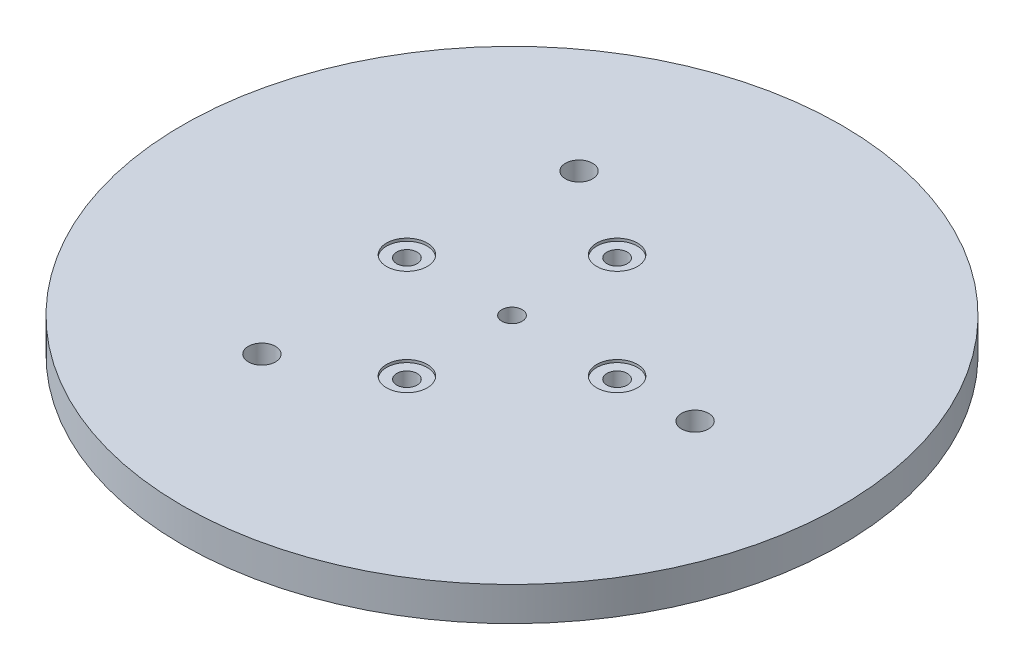
ISO-10303-21;
HEADER;
FILE_DESCRIPTION(('STEP AP214'),'2;1');
FILE_NAME('part.step','',(''),(''),'','','');
FILE_SCHEMA(('AUTOMOTIVE_DESIGN { 1 0 10303 214 1 1 1 1 }'));
ENDSEC;
DATA;
#1=APPLICATION_CONTEXT('core data for automotive mechanical design processes');
#2=APPLICATION_PROTOCOL_DEFINITION('international standard','automotive_design',2000,#1);
#3=PRODUCT_CONTEXT('',#1,'mechanical');
#4=PRODUCT('Part','Part','',(#3));
#5=PRODUCT_RELATED_PRODUCT_CATEGORY('part','',(#4));
#6=PRODUCT_DEFINITION_FORMATION('','',#4);
#7=PRODUCT_DEFINITION_CONTEXT('part definition',#1,'design');
#8=PRODUCT_DEFINITION('design','',#6,#7);
#9=PRODUCT_DEFINITION_SHAPE('','',#8);
#10=(LENGTH_UNIT() NAMED_UNIT(*) SI_UNIT(.MILLI.,.METRE.));
#11=(NAMED_UNIT(*) PLANE_ANGLE_UNIT() SI_UNIT($,.RADIAN.));
#12=(NAMED_UNIT(*) SI_UNIT($,.STERADIAN.) SOLID_ANGLE_UNIT());
#13=UNCERTAINTY_MEASURE_WITH_UNIT(LENGTH_MEASURE(1.E-05),#10,'distance_accuracy_value','');
#14=(GEOMETRIC_REPRESENTATION_CONTEXT(3) GLOBAL_UNCERTAINTY_ASSIGNED_CONTEXT((#13)) GLOBAL_UNIT_ASSIGNED_CONTEXT((#10,
#11,#12)) REPRESENTATION_CONTEXT('',''));
#15=CARTESIAN_POINT('',(0.,0.,0.));
#16=DIRECTION('',(0.,0.,1.));
#17=DIRECTION('',(1.,0.,0.));
#18=AXIS2_PLACEMENT_3D('',#15,#16,#17);
#19=CARTESIAN_POINT('',(-15.5,-19.,0.));
#20=DIRECTION('',(0.,1.,0.));
#21=DIRECTION('',(0.,0.,1.));
#22=AXIS2_PLACEMENT_3D('',#19,#20,#21);
#23=CYLINDRICAL_SURFACE('',#22,1.5);
#24=CARTESIAN_POINT('',(-15.5,1.,0.));
#25=DIRECTION('',(0.,1.,0.));
#26=DIRECTION('',(0.,0.,1.));
#27=AXIS2_PLACEMENT_3D('',#24,#25,#26);
#28=CIRCLE('',#27,1.5);
#29=CARTESIAN_POINT('',(-15.5,1.,1.5));
#30=VERTEX_POINT('',#29);
#31=EDGE_CURVE('E52',#30,#30,#28,.T.);
#32=ORIENTED_EDGE('',*,*,#31,.F.);
#33=EDGE_LOOP('',(#32));
#34=FACE_BOUND('',#33,.T.);
#35=CARTESIAN_POINT('',(-15.5,5.6,0.));
#36=DIRECTION('',(0.,1.,0.));
#37=DIRECTION('',(0.,0.,1.));
#38=AXIS2_PLACEMENT_3D('',#35,#36,#37);
#39=CIRCLE('',#38,1.5);
#40=CARTESIAN_POINT('',(-15.5,5.6,1.5));
#41=VERTEX_POINT('',#40);
#42=EDGE_CURVE('E114',#41,#41,#39,.T.);
#43=ORIENTED_EDGE('',*,*,#42,.T.);
#44=EDGE_LOOP('',(#43));
#45=FACE_BOUND('',#44,.T.);
#46=ADVANCED_FACE('F14',(#34,#45),#23,.F.);
#47=CARTESIAN_POINT('',(0.,-19.,-15.5));
#48=DIRECTION('',(0.,1.,0.));
#49=DIRECTION('',(0.,0.,1.));
#50=AXIS2_PLACEMENT_3D('',#47,#48,#49);
#51=CYLINDRICAL_SURFACE('',#50,1.5);
#52=CARTESIAN_POINT('',(0.,1.,-15.5));
#53=DIRECTION('',(0.,1.,0.));
#54=DIRECTION('',(0.,0.,1.));
#55=AXIS2_PLACEMENT_3D('',#52,#53,#54);
#56=CIRCLE('',#55,1.5);
#57=CARTESIAN_POINT('',(0.,1.,-14.));
#58=VERTEX_POINT('',#57);
#59=EDGE_CURVE('E56',#58,#58,#56,.T.);
#60=ORIENTED_EDGE('',*,*,#59,.F.);
#61=EDGE_LOOP('',(#60));
#62=FACE_BOUND('',#61,.T.);
#63=CARTESIAN_POINT('',(0.,5.6,-15.5));
#64=DIRECTION('',(0.,1.,0.));
#65=DIRECTION('',(0.,0.,1.));
#66=AXIS2_PLACEMENT_3D('',#63,#64,#65);
#67=CIRCLE('',#66,1.5);
#68=CARTESIAN_POINT('',(0.,5.6,-14.));
#69=VERTEX_POINT('',#68);
#70=EDGE_CURVE('E126',#69,#69,#67,.T.);
#71=ORIENTED_EDGE('',*,*,#70,.T.);
#72=EDGE_LOOP('',(#71));
#73=FACE_BOUND('',#72,.T.);
#74=ADVANCED_FACE('F176',(#62,#73),#51,.F.);
#75=CARTESIAN_POINT('',(15.5,-19.,0.));
#76=DIRECTION('',(0.,1.,0.));
#77=DIRECTION('',(0.,0.,1.));
#78=AXIS2_PLACEMENT_3D('',#75,#76,#77);
#79=CYLINDRICAL_SURFACE('',#78,1.5);
#80=CARTESIAN_POINT('',(15.5,1.,0.));
#81=DIRECTION('',(0.,1.,0.));
#82=DIRECTION('',(0.,0.,1.));
#83=AXIS2_PLACEMENT_3D('',#80,#81,#82);
#84=CIRCLE('',#83,1.5);
#85=CARTESIAN_POINT('',(15.5,1.,1.5));
#86=VERTEX_POINT('',#85);
#87=EDGE_CURVE('E61',#86,#86,#84,.T.);
#88=ORIENTED_EDGE('',*,*,#87,.F.);
#89=EDGE_LOOP('',(#88));
#90=FACE_BOUND('',#89,.T.);
#91=CARTESIAN_POINT('',(15.5,5.6,0.));
#92=DIRECTION('',(0.,1.,0.));
#93=DIRECTION('',(0.,0.,1.));
#94=AXIS2_PLACEMENT_3D('',#91,#92,#93);
#95=CIRCLE('',#94,1.5);
#96=CARTESIAN_POINT('',(15.5,5.6,1.5));
#97=VERTEX_POINT('',#96);
#98=EDGE_CURVE('E103',#97,#97,#95,.T.);
#99=ORIENTED_EDGE('',*,*,#98,.T.);
#100=EDGE_LOOP('',(#99));
#101=FACE_BOUND('',#100,.T.);
#102=ADVANCED_FACE('F81',(#90,#101),#79,.F.);
#103=CARTESIAN_POINT('',(0.,-19.,15.5));
#104=DIRECTION('',(0.,1.,0.));
#105=DIRECTION('',(0.,0.,1.));
#106=AXIS2_PLACEMENT_3D('',#103,#104,#105);
#107=CYLINDRICAL_SURFACE('',#106,1.5);
#108=CARTESIAN_POINT('',(0.,1.,15.5));
#109=DIRECTION('',(0.,1.,0.));
#110=DIRECTION('',(0.,0.,1.));
#111=AXIS2_PLACEMENT_3D('',#108,#109,#110);
#112=CIRCLE('',#111,1.5);
#113=CARTESIAN_POINT('',(0.,1.,17.));
#114=VERTEX_POINT('',#113);
#115=EDGE_CURVE('E18',#114,#114,#112,.T.);
#116=ORIENTED_EDGE('',*,*,#115,.F.);
#117=EDGE_LOOP('',(#116));
#118=FACE_BOUND('',#117,.T.);
#119=CARTESIAN_POINT('',(0.,5.6,15.5));
#120=DIRECTION('',(0.,1.,0.));
#121=DIRECTION('',(0.,0.,1.));
#122=AXIS2_PLACEMENT_3D('',#119,#120,#121);
#123=CIRCLE('',#122,1.5);
#124=CARTESIAN_POINT('',(0.,5.6,17.));
#125=VERTEX_POINT('',#124);
#126=EDGE_CURVE('E85',#125,#125,#123,.T.);
#127=ORIENTED_EDGE('',*,*,#126,.T.);
#128=EDGE_LOOP('',(#127));
#129=FACE_BOUND('',#128,.T.);
#130=ADVANCED_FACE('F77',(#118,#129),#107,.F.);
#131=CARTESIAN_POINT('',(-13.5,6.,23.3826859021798));
#132=DIRECTION('',(0.,-1.,0.));
#133=DIRECTION('',(0.,0.,-1.));
#134=AXIS2_PLACEMENT_3D('',#131,#132,#133);
#135=CYLINDRICAL_SURFACE('',#134,2.);
#136=CARTESIAN_POINT('',(-13.5,6.,23.3826859021798));
#137=DIRECTION('',(0.,1.,0.));
#138=DIRECTION('',(0.,0.,1.));
#139=AXIS2_PLACEMENT_3D('',#136,#137,#138);
#140=CIRCLE('',#139,2.);
#141=CARTESIAN_POINT('',(-13.5,6.,25.3826859021798));
#142=VERTEX_POINT('',#141);
#143=EDGE_CURVE('E23',#142,#142,#140,.T.);
#144=ORIENTED_EDGE('',*,*,#143,.T.);
#145=EDGE_LOOP('',(#144));
#146=FACE_BOUND('',#145,.T.);
#147=CARTESIAN_POINT('',(-13.5,1.,23.3826859021798));
#148=DIRECTION('',(0.,1.,0.));
#149=DIRECTION('',(0.,0.,1.));
#150=AXIS2_PLACEMENT_3D('',#147,#148,#149);
#151=CIRCLE('',#150,2.);
#152=CARTESIAN_POINT('',(-13.5,1.,25.3826859021798));
#153=VERTEX_POINT('',#152);
#154=EDGE_CURVE('E43',#153,#153,#151,.T.);
#155=ORIENTED_EDGE('',*,*,#154,.F.);
#156=EDGE_LOOP('',(#155));
#157=FACE_BOUND('',#156,.T.);
#158=ADVANCED_FACE('F80',(#146,#157),#135,.F.);
#159=CARTESIAN_POINT('',(27.,6.,0.));
#160=DIRECTION('',(0.,-1.,0.));
#161=DIRECTION('',(0.,0.,-1.));
#162=AXIS2_PLACEMENT_3D('',#159,#160,#161);
#163=CYLINDRICAL_SURFACE('',#162,2.);
#164=CARTESIAN_POINT('',(27.,6.,0.));
#165=DIRECTION('',(0.,1.,0.));
#166=DIRECTION('',(0.,0.,1.));
#167=AXIS2_PLACEMENT_3D('',#164,#165,#166);
#168=CIRCLE('',#167,2.);
#169=CARTESIAN_POINT('',(27.,6.,2.));
#170=VERTEX_POINT('',#169);
#171=EDGE_CURVE('E31',#170,#170,#168,.T.);
#172=ORIENTED_EDGE('',*,*,#171,.T.);
#173=EDGE_LOOP('',(#172));
#174=FACE_BOUND('',#173,.T.);
#175=CARTESIAN_POINT('',(27.,1.,0.));
#176=DIRECTION('',(0.,1.,0.));
#177=DIRECTION('',(0.,0.,1.));
#178=AXIS2_PLACEMENT_3D('',#175,#176,#177);
#179=CIRCLE('',#178,2.);
#180=CARTESIAN_POINT('',(27.,1.,2.));
#181=VERTEX_POINT('',#180);
#182=EDGE_CURVE('E39',#181,#181,#179,.T.);
#183=ORIENTED_EDGE('',*,*,#182,.F.);
#184=EDGE_LOOP('',(#183));
#185=FACE_BOUND('',#184,.T.);
#186=ADVANCED_FACE('F145',(#174,#185),#163,.F.);
#187=CARTESIAN_POINT('',(-13.5,6.,-23.3826859021798));
#188=DIRECTION('',(0.,-1.,0.));
#189=DIRECTION('',(0.,0.,-1.));
#190=AXIS2_PLACEMENT_3D('',#187,#188,#189);
#191=CYLINDRICAL_SURFACE('',#190,2.);
#192=CARTESIAN_POINT('',(-13.5,6.,-23.3826859021798));
#193=DIRECTION('',(0.,1.,0.));
#194=DIRECTION('',(0.,0.,1.));
#195=AXIS2_PLACEMENT_3D('',#192,#193,#194);
#196=CIRCLE('',#195,2.);
#197=CARTESIAN_POINT('',(-13.5,6.,-21.3826859021799));
#198=VERTEX_POINT('',#197);
#199=EDGE_CURVE('E51',#198,#198,#196,.T.);
#200=ORIENTED_EDGE('',*,*,#199,.T.);
#201=EDGE_LOOP('',(#200));
#202=FACE_BOUND('',#201,.T.);
#203=CARTESIAN_POINT('',(-13.5,1.,-23.3826859021798));
#204=DIRECTION('',(0.,1.,0.));
#205=DIRECTION('',(0.,0.,1.));
#206=AXIS2_PLACEMENT_3D('',#203,#204,#205);
#207=CIRCLE('',#206,2.);
#208=CARTESIAN_POINT('',(-13.5,1.,-21.3826859021799));
#209=VERTEX_POINT('',#208);
#210=EDGE_CURVE('E35',#209,#209,#207,.T.);
#211=ORIENTED_EDGE('',*,*,#210,.F.);
#212=EDGE_LOOP('',(#211));
#213=FACE_BOUND('',#212,.T.);
#214=ADVANCED_FACE('F16',(#202,#213),#191,.F.);
#215=CARTESIAN_POINT('',(0.,6.,0.));
#216=DIRECTION('',(0.,-1.,0.));
#217=DIRECTION('',(0.,0.,-1.));
#218=AXIS2_PLACEMENT_3D('',#215,#216,#217);
#219=CYLINDRICAL_SURFACE('',#218,48.6);
#220=CARTESIAN_POINT('',(0.,6.,0.));
#221=DIRECTION('',(0.,1.,0.));
#222=DIRECTION('',(0.,0.,1.));
#223=AXIS2_PLACEMENT_3D('',#220,#221,#222);
#224=CIRCLE('',#223,48.6);
#225=CARTESIAN_POINT('',(0.,6.,48.6));
#226=VERTEX_POINT('',#225);
#227=EDGE_CURVE('E9',#226,#226,#224,.T.);
#228=ORIENTED_EDGE('',*,*,#227,.F.);
#229=EDGE_LOOP('',(#228));
#230=FACE_BOUND('',#229,.T.);
#231=CARTESIAN_POINT('',(0.,1.,0.));
#232=DIRECTION('',(0.,1.,0.));
#233=DIRECTION('',(0.,0.,1.));
#234=AXIS2_PLACEMENT_3D('',#231,#232,#233);
#235=CIRCLE('',#234,48.6);
#236=CARTESIAN_POINT('',(0.,1.,48.6));
#237=VERTEX_POINT('',#236);
#238=EDGE_CURVE('E47',#237,#237,#235,.T.);
#239=ORIENTED_EDGE('',*,*,#238,.T.);
#240=EDGE_LOOP('',(#239));
#241=FACE_BOUND('',#240,.T.);
#242=ADVANCED_FACE('F151',(#230,#241),#219,.T.);
#243=CARTESIAN_POINT('',(0.,6.,0.));
#244=DIRECTION('',(0.,1.,0.));
#245=DIRECTION('',(-1.,0.,0.));
#246=AXIS2_PLACEMENT_3D('',#243,#244,#245);
#247=PLANE('',#246);
#248=CARTESIAN_POINT('',(0.,6.,15.5));
#249=DIRECTION('',(0.,1.,0.));
#250=DIRECTION('',(0.,0.,1.));
#251=AXIS2_PLACEMENT_3D('',#248,#249,#250);
#252=CIRCLE('',#251,3.);
#253=CARTESIAN_POINT('',(0.,6.,18.5));
#254=VERTEX_POINT('',#253);
#255=EDGE_CURVE('E96',#254,#254,#252,.T.);
#256=ORIENTED_EDGE('',*,*,#255,.F.);
#257=EDGE_LOOP('',(#256));
#258=FACE_BOUND('',#257,.T.);
#259=CARTESIAN_POINT('',(15.5,6.,0.));
#260=DIRECTION('',(0.,1.,0.));
#261=DIRECTION('',(0.,0.,1.));
#262=AXIS2_PLACEMENT_3D('',#259,#260,#261);
#263=CIRCLE('',#262,3.);
#264=CARTESIAN_POINT('',(15.5,6.,3.));
#265=VERTEX_POINT('',#264);
#266=EDGE_CURVE('E107',#265,#265,#263,.T.);
#267=ORIENTED_EDGE('',*,*,#266,.F.);
#268=EDGE_LOOP('',(#267));
#269=FACE_BOUND('',#268,.T.);
#270=CARTESIAN_POINT('',(-15.5,6.,0.));
#271=DIRECTION('',(0.,1.,0.));
#272=DIRECTION('',(0.,0.,1.));
#273=AXIS2_PLACEMENT_3D('',#270,#271,#272);
#274=CIRCLE('',#273,3.);
#275=CARTESIAN_POINT('',(-15.5,6.,3.));
#276=VERTEX_POINT('',#275);
#277=EDGE_CURVE('E119',#276,#276,#274,.T.);
#278=ORIENTED_EDGE('',*,*,#277,.F.);
#279=EDGE_LOOP('',(#278));
#280=FACE_BOUND('',#279,.T.);
#281=CARTESIAN_POINT('',(0.,6.,-15.5));
#282=DIRECTION('',(0.,1.,0.));
#283=DIRECTION('',(0.,0.,1.));
#284=AXIS2_PLACEMENT_3D('',#281,#282,#283);
#285=CIRCLE('',#284,3.);
#286=CARTESIAN_POINT('',(0.,6.,-12.5));
#287=VERTEX_POINT('',#286);
#288=EDGE_CURVE('E131',#287,#287,#285,.T.);
#289=ORIENTED_EDGE('',*,*,#288,.F.);
#290=EDGE_LOOP('',(#289));
#291=FACE_BOUND('',#290,.T.);
#292=CARTESIAN_POINT('',(0.,6.,0.));
#293=DIRECTION('',(0.,1.,0.));
#294=DIRECTION('',(0.,0.,1.));
#295=AXIS2_PLACEMENT_3D('',#292,#293,#294);
#296=CIRCLE('',#295,1.5);
#297=CARTESIAN_POINT('',(0.,6.,1.5));
#298=VERTEX_POINT('',#297);
#299=EDGE_CURVE('E57',#298,#298,#296,.T.);
#300=ORIENTED_EDGE('',*,*,#299,.F.);
#301=EDGE_LOOP('',(#300));
#302=FACE_BOUND('',#301,.T.);
#303=ORIENTED_EDGE('',*,*,#199,.F.);
#304=EDGE_LOOP('',(#303));
#305=FACE_BOUND('',#304,.T.);
#306=ORIENTED_EDGE('',*,*,#171,.F.);
#307=EDGE_LOOP('',(#306));
#308=FACE_BOUND('',#307,.T.);
#309=ORIENTED_EDGE('',*,*,#143,.F.);
#310=EDGE_LOOP('',(#309));
#311=FACE_BOUND('',#310,.T.);
#312=ORIENTED_EDGE('',*,*,#227,.T.);
#313=EDGE_LOOP('',(#312));
#314=FACE_BOUND('',#313,.T.);
#315=ADVANCED_FACE('F148',(#258,#269,#280,#291,#302,#305,#308,#311,#314),#247,.T.);
#316=CARTESIAN_POINT('',(0.,1.,0.));
#317=DIRECTION('',(0.,1.,0.));
#318=DIRECTION('',(-1.,0.,0.));
#319=AXIS2_PLACEMENT_3D('',#316,#317,#318);
#320=PLANE('',#319);
#321=ORIENTED_EDGE('',*,*,#115,.T.);
#322=EDGE_LOOP('',(#321));
#323=FACE_BOUND('',#322,.T.);
#324=CARTESIAN_POINT('',(0.,1.,0.));
#325=DIRECTION('',(0.,1.,0.));
#326=DIRECTION('',(0.,0.,1.));
#327=AXIS2_PLACEMENT_3D('',#324,#325,#326);
#328=CIRCLE('',#327,1.5);
#329=CARTESIAN_POINT('',(0.,1.,1.5));
#330=VERTEX_POINT('',#329);
#331=EDGE_CURVE('E64',#330,#330,#328,.T.);
#332=ORIENTED_EDGE('',*,*,#331,.T.);
#333=EDGE_LOOP('',(#332));
#334=FACE_BOUND('',#333,.T.);
#335=ORIENTED_EDGE('',*,*,#87,.T.);
#336=EDGE_LOOP('',(#335));
#337=FACE_BOUND('',#336,.T.);
#338=ORIENTED_EDGE('',*,*,#59,.T.);
#339=EDGE_LOOP('',(#338));
#340=FACE_BOUND('',#339,.T.);
#341=ORIENTED_EDGE('',*,*,#31,.T.);
#342=EDGE_LOOP('',(#341));
#343=FACE_BOUND('',#342,.T.);
#344=ORIENTED_EDGE('',*,*,#210,.T.);
#345=EDGE_LOOP('',(#344));
#346=FACE_BOUND('',#345,.T.);
#347=ORIENTED_EDGE('',*,*,#182,.T.);
#348=EDGE_LOOP('',(#347));
#349=FACE_BOUND('',#348,.T.);
#350=ORIENTED_EDGE('',*,*,#154,.T.);
#351=EDGE_LOOP('',(#350));
#352=FACE_BOUND('',#351,.T.);
#353=ORIENTED_EDGE('',*,*,#238,.F.);
#354=EDGE_LOOP('',(#353));
#355=FACE_BOUND('',#354,.T.);
#356=ADVANCED_FACE('F75',(#323,#334,#337,#340,#343,#346,#349,#352,#355),#320,.F.);
#357=CARTESIAN_POINT('',(0.,-19.,0.));
#358=DIRECTION('',(0.,1.,0.));
#359=DIRECTION('',(0.,0.,1.));
#360=AXIS2_PLACEMENT_3D('',#357,#358,#359);
#361=CYLINDRICAL_SURFACE('',#360,1.5);
#362=ORIENTED_EDGE('',*,*,#299,.T.);
#363=EDGE_LOOP('',(#362));
#364=FACE_BOUND('',#363,.T.);
#365=ORIENTED_EDGE('',*,*,#331,.F.);
#366=EDGE_LOOP('',(#365));
#367=FACE_BOUND('',#366,.T.);
#368=ADVANCED_FACE('F163',(#364,#367),#361,.F.);
#369=CARTESIAN_POINT('',(0.,5.6,15.5));
#370=DIRECTION('',(0.,1.,0.));
#371=DIRECTION('',(0.,0.,1.));
#372=AXIS2_PLACEMENT_3D('',#369,#370,#371);
#373=CYLINDRICAL_SURFACE('',#372,3.);
#374=CARTESIAN_POINT('',(0.,5.6,15.5));
#375=DIRECTION('',(0.,1.,0.));
#376=DIRECTION('',(0.,0.,1.));
#377=AXIS2_PLACEMENT_3D('',#374,#375,#376);
#378=CIRCLE('',#377,3.);
#379=CARTESIAN_POINT('',(0.,5.6,18.5));
#380=VERTEX_POINT('',#379);
#381=EDGE_CURVE('E88',#380,#380,#378,.T.);
#382=ORIENTED_EDGE('',*,*,#381,.F.);
#383=EDGE_LOOP('',(#382));
#384=FACE_BOUND('',#383,.T.);
#385=ORIENTED_EDGE('',*,*,#255,.T.);
#386=EDGE_LOOP('',(#385));
#387=FACE_BOUND('',#386,.T.);
#388=ADVANCED_FACE('F189',(#384,#387),#373,.F.);
#389=CARTESIAN_POINT('',(0.,5.6,0.));
#390=DIRECTION('',(0.,1.,0.));
#391=DIRECTION('',(-1.,0.,0.));
#392=AXIS2_PLACEMENT_3D('',#389,#390,#391);
#393=PLANE('',#392);
#394=ORIENTED_EDGE('',*,*,#126,.F.);
#395=EDGE_LOOP('',(#394));
#396=FACE_BOUND('',#395,.T.);
#397=ORIENTED_EDGE('',*,*,#381,.T.);
#398=EDGE_LOOP('',(#397));
#399=FACE_BOUND('',#398,.T.);
#400=ADVANCED_FACE('F214',(#396,#399),#393,.T.);
#401=CARTESIAN_POINT('',(15.5,5.6,0.));
#402=DIRECTION('',(0.,1.,0.));
#403=DIRECTION('',(0.,0.,1.));
#404=AXIS2_PLACEMENT_3D('',#401,#402,#403);
#405=CYLINDRICAL_SURFACE('',#404,3.);
#406=CARTESIAN_POINT('',(15.5,5.6,0.));
#407=DIRECTION('',(0.,1.,0.));
#408=DIRECTION('',(0.,0.,1.));
#409=AXIS2_PLACEMENT_3D('',#406,#407,#408);
#410=CIRCLE('',#409,3.);
#411=CARTESIAN_POINT('',(15.5,5.6,3.));
#412=VERTEX_POINT('',#411);
#413=EDGE_CURVE('E102',#412,#412,#410,.T.);
#414=ORIENTED_EDGE('',*,*,#413,.F.);
#415=EDGE_LOOP('',(#414));
#416=FACE_BOUND('',#415,.T.);
#417=ORIENTED_EDGE('',*,*,#266,.T.);
#418=EDGE_LOOP('',(#417));
#419=FACE_BOUND('',#418,.T.);
#420=ADVANCED_FACE('F211',(#416,#419),#405,.F.);
#421=CARTESIAN_POINT('',(0.,5.6,0.));
#422=DIRECTION('',(0.,1.,0.));
#423=DIRECTION('',(-1.,0.,0.));
#424=AXIS2_PLACEMENT_3D('',#421,#422,#423);
#425=PLANE('',#424);
#426=ORIENTED_EDGE('',*,*,#98,.F.);
#427=EDGE_LOOP('',(#426));
#428=FACE_BOUND('',#427,.T.);
#429=ORIENTED_EDGE('',*,*,#413,.T.);
#430=EDGE_LOOP('',(#429));
#431=FACE_BOUND('',#430,.T.);
#432=ADVANCED_FACE('F198',(#428,#431),#425,.T.);
#433=CARTESIAN_POINT('',(0.,5.6,-15.5));
#434=DIRECTION('',(0.,1.,0.));
#435=DIRECTION('',(0.,0.,1.));
#436=AXIS2_PLACEMENT_3D('',#433,#434,#435);
#437=CYLINDRICAL_SURFACE('',#436,3.);
#438=CARTESIAN_POINT('',(0.,5.6,-15.5));
#439=DIRECTION('',(0.,1.,0.));
#440=DIRECTION('',(0.,0.,1.));
#441=AXIS2_PLACEMENT_3D('',#438,#439,#440);
#442=CIRCLE('',#441,3.);
#443=CARTESIAN_POINT('',(0.,5.6,-12.5));
#444=VERTEX_POINT('',#443);
#445=EDGE_CURVE('E127',#444,#444,#442,.T.);
#446=ORIENTED_EDGE('',*,*,#445,.F.);
#447=EDGE_LOOP('',(#446));
#448=FACE_BOUND('',#447,.T.);
#449=ORIENTED_EDGE('',*,*,#288,.T.);
#450=EDGE_LOOP('',(#449));
#451=FACE_BOUND('',#450,.T.);
#452=ADVANCED_FACE('F194',(#448,#451),#437,.F.);
#453=CARTESIAN_POINT('',(0.,5.6,0.));
#454=DIRECTION('',(0.,1.,0.));
#455=DIRECTION('',(-1.,0.,0.));
#456=AXIS2_PLACEMENT_3D('',#453,#454,#455);
#457=PLANE('',#456);
#458=ORIENTED_EDGE('',*,*,#70,.F.);
#459=EDGE_LOOP('',(#458));
#460=FACE_BOUND('',#459,.T.);
#461=ORIENTED_EDGE('',*,*,#445,.T.);
#462=EDGE_LOOP('',(#461));
#463=FACE_BOUND('',#462,.T.);
#464=ADVANCED_FACE('F197',(#460,#463),#457,.T.);
#465=CARTESIAN_POINT('',(-15.5,5.6,0.));
#466=DIRECTION('',(0.,1.,0.));
#467=DIRECTION('',(0.,0.,1.));
#468=AXIS2_PLACEMENT_3D('',#465,#466,#467);
#469=CYLINDRICAL_SURFACE('',#468,3.);
#470=CARTESIAN_POINT('',(-15.5,5.6,0.));
#471=DIRECTION('',(0.,1.,0.));
#472=DIRECTION('',(0.,0.,1.));
#473=AXIS2_PLACEMENT_3D('',#470,#471,#472);
#474=CIRCLE('',#473,3.);
#475=CARTESIAN_POINT('',(-15.5,5.6,3.));
#476=VERTEX_POINT('',#475);
#477=EDGE_CURVE('E115',#476,#476,#474,.T.);
#478=ORIENTED_EDGE('',*,*,#477,.F.);
#479=EDGE_LOOP('',(#478));
#480=FACE_BOUND('',#479,.T.);
#481=ORIENTED_EDGE('',*,*,#277,.T.);
#482=EDGE_LOOP('',(#481));
#483=FACE_BOUND('',#482,.T.);
#484=ADVANCED_FACE('F202',(#480,#483),#469,.F.);
#485=CARTESIAN_POINT('',(0.,5.6,0.));
#486=DIRECTION('',(0.,1.,0.));
#487=DIRECTION('',(-1.,0.,0.));
#488=AXIS2_PLACEMENT_3D('',#485,#486,#487);
#489=PLANE('',#488);
#490=ORIENTED_EDGE('',*,*,#42,.F.);
#491=EDGE_LOOP('',(#490));
#492=FACE_BOUND('',#491,.T.);
#493=ORIENTED_EDGE('',*,*,#477,.T.);
#494=EDGE_LOOP('',(#493));
#495=FACE_BOUND('',#494,.T.);
#496=ADVANCED_FACE('F206',(#492,#495),#489,.T.);
#497=CLOSED_SHELL('',(#46,#74,#102,#130,#158,#186,#214,#242,#315,#356,#368,#388,#400,#420,#432,
#452,#464,#484,#496));
#498=MANIFOLD_SOLID_BREP('B1',#497);
#499=ADVANCED_BREP_SHAPE_REPRESENTATION('',(#18,#498),#14);
#500=SHAPE_DEFINITION_REPRESENTATION(#9,#499);
ENDSEC;
END-ISO-10303-21;
